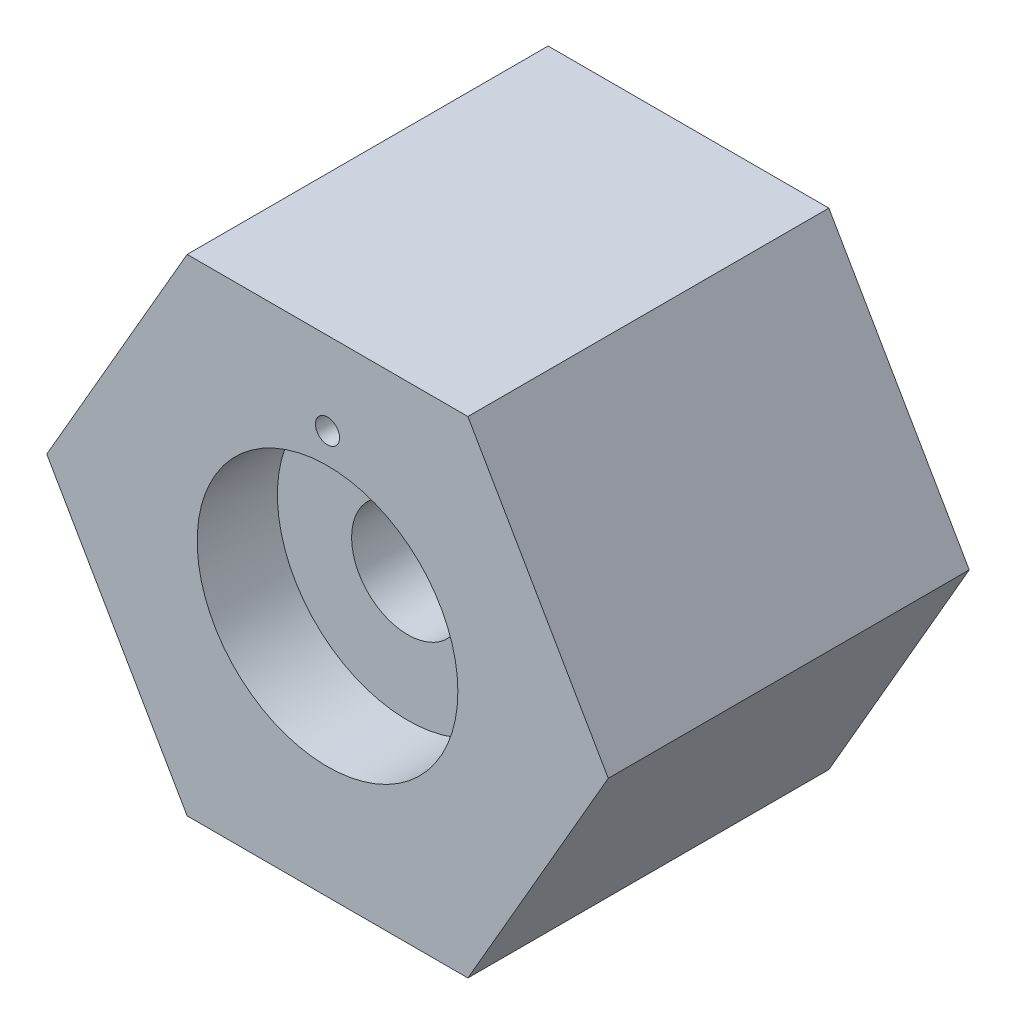
ISO-10303-21;
HEADER;
FILE_DESCRIPTION(('STEP AP214'),'2;1');
FILE_NAME('part.step','',(''),(''),'','','');
FILE_SCHEMA(('AUTOMOTIVE_DESIGN { 1 0 10303 214 1 1 1 1 }'));
ENDSEC;
DATA;
#1=APPLICATION_CONTEXT('core data for automotive mechanical design processes');
#2=APPLICATION_PROTOCOL_DEFINITION('international standard','automotive_design',2000,#1);
#3=PRODUCT_CONTEXT('',#1,'mechanical');
#4=PRODUCT('Part','Part','',(#3));
#5=PRODUCT_RELATED_PRODUCT_CATEGORY('part','',(#4));
#6=PRODUCT_DEFINITION_FORMATION('','',#4);
#7=PRODUCT_DEFINITION_CONTEXT('part definition',#1,'design');
#8=PRODUCT_DEFINITION('design','',#6,#7);
#9=PRODUCT_DEFINITION_SHAPE('','',#8);
#10=(LENGTH_UNIT() NAMED_UNIT(*) SI_UNIT(.MILLI.,.METRE.));
#11=(NAMED_UNIT(*) PLANE_ANGLE_UNIT() SI_UNIT($,.RADIAN.));
#12=(NAMED_UNIT(*) SI_UNIT($,.STERADIAN.) SOLID_ANGLE_UNIT());
#13=UNCERTAINTY_MEASURE_WITH_UNIT(LENGTH_MEASURE(1.E-05),#10,'distance_accuracy_value','');
#14=(GEOMETRIC_REPRESENTATION_CONTEXT(3) GLOBAL_UNCERTAINTY_ASSIGNED_CONTEXT((#13)) GLOBAL_UNIT_ASSIGNED_CONTEXT((#10,
#11,#12)) REPRESENTATION_CONTEXT('',''));
#15=CARTESIAN_POINT('',(0.,0.,0.));
#16=DIRECTION('',(0.,0.,1.));
#17=DIRECTION('',(1.,0.,0.));
#18=AXIS2_PLACEMENT_3D('',#15,#16,#17);
#19=CARTESIAN_POINT('',(-35.,0.,22.5));
#20=DIRECTION('',(0.866025403784439,-0.5,0.));
#21=DIRECTION('',(0.5,0.866025403784439,0.));
#22=AXIS2_PLACEMENT_3D('',#19,#20,#21);
#23=PLANE('',#22);
#24=DIRECTION('',(-0.5,-0.866025403784439,0.));
#25=VECTOR('',#24,1.);
#26=CARTESIAN_POINT('',(-35.,0.,-22.5));
#27=LINE('',#26,#25);
#28=CARTESIAN_POINT('',(-17.5,30.3108891324554,-22.5));
#29=VERTEX_POINT('',#28);
#30=CARTESIAN_POINT('',(-35.,0.,-22.5));
#31=VERTEX_POINT('',#30);
#32=EDGE_CURVE('E120',#29,#31,#27,.T.);
#33=ORIENTED_EDGE('',*,*,#32,.T.);
#34=DIRECTION('',(0.,0.,-1.));
#35=VECTOR('',#34,1.);
#36=CARTESIAN_POINT('',(-35.,0.,22.5));
#37=LINE('',#36,#35);
#38=CARTESIAN_POINT('',(-35.,0.,22.5));
#39=VERTEX_POINT('',#38);
#40=EDGE_CURVE('E11',#39,#31,#37,.T.);
#41=ORIENTED_EDGE('',*,*,#40,.F.);
#42=DIRECTION('',(-0.5,-0.866025403784439,0.));
#43=VECTOR('',#42,1.);
#44=CARTESIAN_POINT('',(-35.,0.,22.5));
#45=LINE('',#44,#43);
#46=CARTESIAN_POINT('',(-17.5,30.3108891324554,22.5));
#47=VERTEX_POINT('',#46);
#48=EDGE_CURVE('E131',#47,#39,#45,.T.);
#49=ORIENTED_EDGE('',*,*,#48,.F.);
#50=DIRECTION('',(0.,0.,-1.));
#51=VECTOR('',#50,1.);
#52=CARTESIAN_POINT('',(-17.5,30.3108891324554,22.5));
#53=LINE('',#52,#51);
#54=EDGE_CURVE('E116',#47,#29,#53,.T.);
#55=ORIENTED_EDGE('',*,*,#54,.T.);
#56=EDGE_LOOP('',(#33,#41,#49,#55));
#57=FACE_BOUND('',#56,.T.);
#58=ADVANCED_FACE('F36',(#57),#23,.F.);
#59=CARTESIAN_POINT('',(-17.5,-30.3108891324554,22.5));
#60=DIRECTION('',(0.866025403784439,0.5,0.));
#61=DIRECTION('',(-0.5,0.866025403784439,0.));
#62=AXIS2_PLACEMENT_3D('',#59,#60,#61);
#63=PLANE('',#62);
#64=DIRECTION('',(0.5,-0.866025403784439,0.));
#65=VECTOR('',#64,1.);
#66=CARTESIAN_POINT('',(-17.5,-30.3108891324554,-22.5));
#67=LINE('',#66,#65);
#68=CARTESIAN_POINT('',(-17.5,-30.3108891324554,-22.5));
#69=VERTEX_POINT('',#68);
#70=EDGE_CURVE('E123',#31,#69,#67,.T.);
#71=ORIENTED_EDGE('',*,*,#70,.T.);
#72=DIRECTION('',(0.,0.,-1.));
#73=VECTOR('',#72,1.);
#74=CARTESIAN_POINT('',(-17.5,-30.3108891324554,22.5));
#75=LINE('',#74,#73);
#76=CARTESIAN_POINT('',(-17.5,-30.3108891324554,22.5));
#77=VERTEX_POINT('',#76);
#78=EDGE_CURVE('E44',#77,#69,#75,.T.);
#79=ORIENTED_EDGE('',*,*,#78,.F.);
#80=DIRECTION('',(0.5,-0.866025403784439,0.));
#81=VECTOR('',#80,1.);
#82=CARTESIAN_POINT('',(-17.5,-30.3108891324554,22.5));
#83=LINE('',#82,#81);
#84=EDGE_CURVE('E89',#39,#77,#83,.T.);
#85=ORIENTED_EDGE('',*,*,#84,.F.);
#86=ORIENTED_EDGE('',*,*,#40,.T.);
#87=EDGE_LOOP('',(#71,#79,#85,#86));
#88=FACE_BOUND('',#87,.T.);
#89=ADVANCED_FACE('F156',(#88),#63,.F.);
#90=CARTESIAN_POINT('',(17.5,-30.3108891324554,22.5));
#91=DIRECTION('',(0.,1.,0.));
#92=DIRECTION('',(0.,0.,1.));
#93=AXIS2_PLACEMENT_3D('',#90,#91,#92);
#94=PLANE('',#93);
#95=DIRECTION('',(1.,0.,0.));
#96=VECTOR('',#95,1.);
#97=CARTESIAN_POINT('',(17.5,-30.3108891324554,-22.5));
#98=LINE('',#97,#96);
#99=CARTESIAN_POINT('',(17.5,-30.3108891324554,-22.5));
#100=VERTEX_POINT('',#99);
#101=EDGE_CURVE('E126',#69,#100,#98,.T.);
#102=ORIENTED_EDGE('',*,*,#101,.T.);
#103=DIRECTION('',(0.,0.,-1.));
#104=VECTOR('',#103,1.);
#105=CARTESIAN_POINT('',(17.5,-30.3108891324554,22.5));
#106=LINE('',#105,#104);
#107=CARTESIAN_POINT('',(17.5,-30.3108891324554,22.5));
#108=VERTEX_POINT('',#107);
#109=EDGE_CURVE('E111',#108,#100,#106,.T.);
#110=ORIENTED_EDGE('',*,*,#109,.F.);
#111=DIRECTION('',(1.,0.,0.));
#112=VECTOR('',#111,1.);
#113=CARTESIAN_POINT('',(17.5,-30.3108891324554,22.5));
#114=LINE('',#113,#112);
#115=EDGE_CURVE('E102',#77,#108,#114,.T.);
#116=ORIENTED_EDGE('',*,*,#115,.F.);
#117=ORIENTED_EDGE('',*,*,#78,.T.);
#118=EDGE_LOOP('',(#102,#110,#116,#117));
#119=FACE_BOUND('',#118,.T.);
#120=ADVANCED_FACE('F137',(#119),#94,.F.);
#121=CARTESIAN_POINT('',(35.,0.,22.5));
#122=DIRECTION('',(-0.866025403784439,0.5,0.));
#123=DIRECTION('',(-0.5,-0.866025403784439,0.));
#124=AXIS2_PLACEMENT_3D('',#121,#122,#123);
#125=PLANE('',#124);
#126=DIRECTION('',(0.5,0.866025403784439,0.));
#127=VECTOR('',#126,1.);
#128=CARTESIAN_POINT('',(35.,0.,-22.5));
#129=LINE('',#128,#127);
#130=CARTESIAN_POINT('',(35.,0.,-22.5));
#131=VERTEX_POINT('',#130);
#132=EDGE_CURVE('E110',#100,#131,#129,.T.);
#133=ORIENTED_EDGE('',*,*,#132,.T.);
#134=DIRECTION('',(0.,0.,-1.));
#135=VECTOR('',#134,1.);
#136=CARTESIAN_POINT('',(35.,0.,22.5));
#137=LINE('',#136,#135);
#138=CARTESIAN_POINT('',(35.,0.,22.5));
#139=VERTEX_POINT('',#138);
#140=EDGE_CURVE('E107',#139,#131,#137,.T.);
#141=ORIENTED_EDGE('',*,*,#140,.F.);
#142=DIRECTION('',(0.5,0.866025403784439,0.));
#143=VECTOR('',#142,1.);
#144=CARTESIAN_POINT('',(35.,0.,22.5));
#145=LINE('',#144,#143);
#146=EDGE_CURVE('E96',#108,#139,#145,.T.);
#147=ORIENTED_EDGE('',*,*,#146,.F.);
#148=ORIENTED_EDGE('',*,*,#109,.T.);
#149=EDGE_LOOP('',(#133,#141,#147,#148));
#150=FACE_BOUND('',#149,.T.);
#151=ADVANCED_FACE('F108',(#150),#125,.F.);
#152=CARTESIAN_POINT('',(17.5,30.3108891324554,22.5));
#153=DIRECTION('',(-0.866025403784439,-0.5,0.));
#154=DIRECTION('',(0.5,-0.866025403784439,0.));
#155=AXIS2_PLACEMENT_3D('',#152,#153,#154);
#156=PLANE('',#155);
#157=DIRECTION('',(-0.5,0.866025403784439,0.));
#158=VECTOR('',#157,1.);
#159=CARTESIAN_POINT('',(17.5,30.3108891324554,-22.5));
#160=LINE('',#159,#158);
#161=CARTESIAN_POINT('',(17.5,30.3108891324554,-22.5));
#162=VERTEX_POINT('',#161);
#163=EDGE_CURVE('E75',#131,#162,#160,.T.);
#164=ORIENTED_EDGE('',*,*,#163,.T.);
#165=DIRECTION('',(0.,0.,-1.));
#166=VECTOR('',#165,1.);
#167=CARTESIAN_POINT('',(17.5,30.3108891324554,22.5));
#168=LINE('',#167,#166);
#169=CARTESIAN_POINT('',(17.5,30.3108891324554,22.5));
#170=VERTEX_POINT('',#169);
#171=EDGE_CURVE('E112',#170,#162,#168,.T.);
#172=ORIENTED_EDGE('',*,*,#171,.F.);
#173=DIRECTION('',(-0.5,0.866025403784439,0.));
#174=VECTOR('',#173,1.);
#175=CARTESIAN_POINT('',(17.5,30.3108891324554,22.5));
#176=LINE('',#175,#174);
#177=EDGE_CURVE('E100',#139,#170,#176,.T.);
#178=ORIENTED_EDGE('',*,*,#177,.F.);
#179=ORIENTED_EDGE('',*,*,#140,.T.);
#180=EDGE_LOOP('',(#164,#172,#178,#179));
#181=FACE_BOUND('',#180,.T.);
#182=ADVANCED_FACE('F114',(#181),#156,.F.);
#183=CARTESIAN_POINT('',(-17.5,30.3108891324554,22.5));
#184=DIRECTION('',(0.,-1.,0.));
#185=DIRECTION('',(1.,0.,0.));
#186=AXIS2_PLACEMENT_3D('',#183,#184,#185);
#187=PLANE('',#186);
#188=DIRECTION('',(-1.,0.,0.));
#189=VECTOR('',#188,1.);
#190=CARTESIAN_POINT('',(-17.5,30.3108891324554,-22.5));
#191=LINE('',#190,#189);
#192=EDGE_CURVE('E81',#162,#29,#191,.T.);
#193=ORIENTED_EDGE('',*,*,#192,.T.);
#194=ORIENTED_EDGE('',*,*,#54,.F.);
#195=DIRECTION('',(-1.,0.,0.));
#196=VECTOR('',#195,1.);
#197=CARTESIAN_POINT('',(-17.5,30.3108891324554,22.5));
#198=LINE('',#197,#196);
#199=EDGE_CURVE('E52',#170,#47,#198,.T.);
#200=ORIENTED_EDGE('',*,*,#199,.F.);
#201=ORIENTED_EDGE('',*,*,#171,.T.);
#202=EDGE_LOOP('',(#193,#194,#200,#201));
#203=FACE_BOUND('',#202,.T.);
#204=ADVANCED_FACE('F144',(#203),#187,.F.);
#205=CARTESIAN_POINT('',(0.,0.,22.5));
#206=DIRECTION('',(0.,0.,-1.));
#207=DIRECTION('',(-1.,0.,0.));
#208=AXIS2_PLACEMENT_3D('',#205,#206,#207);
#209=PLANE('',#208);
#210=CARTESIAN_POINT('',(0.,20.,22.5));
#211=DIRECTION('',(0.,0.,1.));
#212=DIRECTION('',(1.,0.,0.));
#213=AXIS2_PLACEMENT_3D('',#210,#211,#212);
#214=CIRCLE('',#213,1.5);
#215=CARTESIAN_POINT('',(1.5,20.,22.5));
#216=VERTEX_POINT('',#215);
#217=EDGE_CURVE('E289',#216,#216,#214,.T.);
#218=ORIENTED_EDGE('',*,*,#217,.F.);
#219=EDGE_LOOP('',(#218));
#220=FACE_BOUND('',#219,.T.);
#221=CARTESIAN_POINT('',(0.,0.,22.5));
#222=DIRECTION('',(0.,0.,1.));
#223=DIRECTION('',(1.,0.,0.));
#224=AXIS2_PLACEMENT_3D('',#221,#222,#223);
#225=CIRCLE('',#224,16.25);
#226=CARTESIAN_POINT('',(16.25,0.,22.5));
#227=VERTEX_POINT('',#226);
#228=EDGE_CURVE('E310',#227,#227,#225,.T.);
#229=ORIENTED_EDGE('',*,*,#228,.F.);
#230=EDGE_LOOP('',(#229));
#231=FACE_BOUND('',#230,.T.);
#232=ORIENTED_EDGE('',*,*,#48,.T.);
#233=ORIENTED_EDGE('',*,*,#84,.T.);
#234=ORIENTED_EDGE('',*,*,#115,.T.);
#235=ORIENTED_EDGE('',*,*,#146,.T.);
#236=ORIENTED_EDGE('',*,*,#177,.T.);
#237=ORIENTED_EDGE('',*,*,#199,.T.);
#238=EDGE_LOOP('',(#232,#233,#234,#235,#236,#237));
#239=FACE_BOUND('',#238,.T.);
#240=ADVANCED_FACE('F98',(#220,#231,#239),#209,.F.);
#241=CARTESIAN_POINT('',(0.,0.,-22.5));
#242=DIRECTION('',(0.,0.,-1.));
#243=DIRECTION('',(-1.,0.,0.));
#244=AXIS2_PLACEMENT_3D('',#241,#242,#243);
#245=PLANE('',#244);
#246=CARTESIAN_POINT('',(0.,20.,-22.5));
#247=DIRECTION('',(0.,0.,1.));
#248=DIRECTION('',(1.,0.,0.));
#249=AXIS2_PLACEMENT_3D('',#246,#247,#248);
#250=CIRCLE('',#249,1.5);
#251=CARTESIAN_POINT('',(1.5,20.,-22.5));
#252=VERTEX_POINT('',#251);
#253=EDGE_CURVE('E290',#252,#252,#250,.T.);
#254=ORIENTED_EDGE('',*,*,#253,.T.);
#255=EDGE_LOOP('',(#254));
#256=FACE_BOUND('',#255,.T.);
#257=CARTESIAN_POINT('',(0.,0.,-22.5));
#258=DIRECTION('',(0.,0.,1.));
#259=DIRECTION('',(1.,0.,0.));
#260=AXIS2_PLACEMENT_3D('',#257,#258,#259);
#261=CIRCLE('',#260,16.25);
#262=CARTESIAN_POINT('',(16.25,0.,-22.5));
#263=VERTEX_POINT('',#262);
#264=EDGE_CURVE('E306',#263,#263,#261,.T.);
#265=ORIENTED_EDGE('',*,*,#264,.T.);
#266=EDGE_LOOP('',(#265));
#267=FACE_BOUND('',#266,.T.);
#268=ORIENTED_EDGE('',*,*,#32,.F.);
#269=ORIENTED_EDGE('',*,*,#192,.F.);
#270=ORIENTED_EDGE('',*,*,#163,.F.);
#271=ORIENTED_EDGE('',*,*,#132,.F.);
#272=ORIENTED_EDGE('',*,*,#101,.F.);
#273=ORIENTED_EDGE('',*,*,#70,.F.);
#274=EDGE_LOOP('',(#268,#269,#270,#271,#272,#273));
#275=FACE_BOUND('',#274,.T.);
#276=ADVANCED_FACE('F140',(#256,#267,#275),#245,.T.);
#277=CARTESIAN_POINT('',(0.,0.,12.5));
#278=DIRECTION('',(0.,0.,1.));
#279=DIRECTION('',(1.,0.,0.));
#280=AXIS2_PLACEMENT_3D('',#277,#278,#279);
#281=CYLINDRICAL_SURFACE('',#280,16.25);
#282=CARTESIAN_POINT('',(0.,0.,12.5));
#283=DIRECTION('',(0.,0.,1.));
#284=DIRECTION('',(1.,0.,0.));
#285=AXIS2_PLACEMENT_3D('',#282,#283,#284);
#286=CIRCLE('',#285,16.25);
#287=CARTESIAN_POINT('',(16.25,0.,12.5));
#288=VERTEX_POINT('',#287);
#289=EDGE_CURVE('E124',#288,#288,#286,.T.);
#290=ORIENTED_EDGE('',*,*,#289,.F.);
#291=EDGE_LOOP('',(#290));
#292=FACE_BOUND('',#291,.T.);
#293=ORIENTED_EDGE('',*,*,#228,.T.);
#294=EDGE_LOOP('',(#293));
#295=FACE_BOUND('',#294,.T.);
#296=ADVANCED_FACE('F184',(#292,#295),#281,.F.);
#297=CARTESIAN_POINT('',(0.,0.,12.5));
#298=DIRECTION('',(0.,0.,1.));
#299=DIRECTION('',(1.,0.,0.));
#300=AXIS2_PLACEMENT_3D('',#297,#298,#299);
#301=PLANE('',#300);
#302=CARTESIAN_POINT('',(0.,0.,12.5));
#303=DIRECTION('',(0.,0.,1.));
#304=DIRECTION('',(1.,0.,0.));
#305=AXIS2_PLACEMENT_3D('',#302,#303,#304);
#306=CIRCLE('',#305,7.);
#307=CARTESIAN_POINT('',(7.,0.,12.5));
#308=VERTEX_POINT('',#307);
#309=EDGE_CURVE('E303',#308,#308,#306,.F.);
#310=ORIENTED_EDGE('',*,*,#309,.T.);
#311=EDGE_LOOP('',(#310));
#312=FACE_BOUND('',#311,.T.);
#313=ORIENTED_EDGE('',*,*,#289,.T.);
#314=EDGE_LOOP('',(#313));
#315=FACE_BOUND('',#314,.T.);
#316=ADVANCED_FACE('F189',(#312,#315),#301,.T.);
#317=CARTESIAN_POINT('',(0.,0.,-12.5));
#318=DIRECTION('',(0.,0.,-1.));
#319=DIRECTION('',(-1.,0.,0.));
#320=AXIS2_PLACEMENT_3D('',#317,#318,#319);
#321=CYLINDRICAL_SURFACE('',#320,16.25);
#322=CARTESIAN_POINT('',(0.,0.,-12.5));
#323=DIRECTION('',(0.,0.,1.));
#324=DIRECTION('',(1.,0.,0.));
#325=AXIS2_PLACEMENT_3D('',#322,#323,#324);
#326=CIRCLE('',#325,16.25);
#327=CARTESIAN_POINT('',(16.25,0.,-12.5));
#328=VERTEX_POINT('',#327);
#329=EDGE_CURVE('E307',#328,#328,#326,.T.);
#330=ORIENTED_EDGE('',*,*,#329,.T.);
#331=EDGE_LOOP('',(#330));
#332=FACE_BOUND('',#331,.T.);
#333=ORIENTED_EDGE('',*,*,#264,.F.);
#334=EDGE_LOOP('',(#333));
#335=FACE_BOUND('',#334,.T.);
#336=ADVANCED_FACE('F199',(#332,#335),#321,.F.);
#337=CARTESIAN_POINT('',(0.,0.,-12.5));
#338=DIRECTION('',(0.,0.,-1.));
#339=DIRECTION('',(1.,0.,0.));
#340=AXIS2_PLACEMENT_3D('',#337,#338,#339);
#341=PLANE('',#340);
#342=CARTESIAN_POINT('',(0.,0.,-12.5));
#343=DIRECTION('',(0.,0.,-1.));
#344=DIRECTION('',(-1.,0.,0.));
#345=AXIS2_PLACEMENT_3D('',#342,#343,#344);
#346=CIRCLE('',#345,7.);
#347=CARTESIAN_POINT('',(-7.,0.,-12.5));
#348=VERTEX_POINT('',#347);
#349=EDGE_CURVE('E299',#348,#348,#346,.T.);
#350=ORIENTED_EDGE('',*,*,#349,.F.);
#351=EDGE_LOOP('',(#350));
#352=FACE_BOUND('',#351,.T.);
#353=ORIENTED_EDGE('',*,*,#329,.F.);
#354=EDGE_LOOP('',(#353));
#355=FACE_BOUND('',#354,.T.);
#356=ADVANCED_FACE('F204',(#352,#355),#341,.T.);
#357=CARTESIAN_POINT('',(0.,0.,32.2989898732233));
#358=DIRECTION('',(0.,0.,-1.));
#359=DIRECTION('',(-1.,0.,0.));
#360=AXIS2_PLACEMENT_3D('',#357,#358,#359);
#361=CYLINDRICAL_SURFACE('',#360,7.);
#362=ORIENTED_EDGE('',*,*,#349,.T.);
#363=EDGE_LOOP('',(#362));
#364=FACE_BOUND('',#363,.T.);
#365=ORIENTED_EDGE('',*,*,#309,.F.);
#366=EDGE_LOOP('',(#365));
#367=FACE_BOUND('',#366,.T.);
#368=ADVANCED_FACE('F221',(#364,#367),#361,.F.);
#369=CARTESIAN_POINT('',(0.,20.,12.5));
#370=DIRECTION('',(0.,0.,1.));
#371=DIRECTION('',(1.,0.,0.));
#372=AXIS2_PLACEMENT_3D('',#369,#370,#371);
#373=CYLINDRICAL_SURFACE('',#372,1.5);
#374=CARTESIAN_POINT('',(0.,20.,12.5));
#375=DIRECTION('',(0.,0.,1.));
#376=DIRECTION('',(1.,0.,0.));
#377=AXIS2_PLACEMENT_3D('',#374,#375,#376);
#378=CIRCLE('',#377,1.5);
#379=CARTESIAN_POINT('',(1.5,20.,12.5));
#380=VERTEX_POINT('',#379);
#381=EDGE_CURVE('E293',#380,#380,#378,.T.);
#382=ORIENTED_EDGE('',*,*,#381,.F.);
#383=EDGE_LOOP('',(#382));
#384=FACE_BOUND('',#383,.T.);
#385=ORIENTED_EDGE('',*,*,#217,.T.);
#386=EDGE_LOOP('',(#385));
#387=FACE_BOUND('',#386,.T.);
#388=ADVANCED_FACE('F231',(#384,#387),#373,.F.);
#389=CARTESIAN_POINT('',(0.,20.,12.5));
#390=DIRECTION('',(0.,0.,1.));
#391=DIRECTION('',(1.,0.,0.));
#392=AXIS2_PLACEMENT_3D('',#389,#390,#391);
#393=PLANE('',#392);
#394=ORIENTED_EDGE('',*,*,#381,.T.);
#395=EDGE_LOOP('',(#394));
#396=FACE_BOUND('',#395,.T.);
#397=ADVANCED_FACE('F246',(#396),#393,.T.);
#398=CARTESIAN_POINT('',(0.,20.,-12.5));
#399=DIRECTION('',(0.,0.,-1.));
#400=DIRECTION('',(-1.,0.,0.));
#401=AXIS2_PLACEMENT_3D('',#398,#399,#400);
#402=CYLINDRICAL_SURFACE('',#401,1.5);
#403=CARTESIAN_POINT('',(0.,20.,-12.5));
#404=DIRECTION('',(0.,0.,1.));
#405=DIRECTION('',(1.,0.,0.));
#406=AXIS2_PLACEMENT_3D('',#403,#404,#405);
#407=CIRCLE('',#406,1.5);
#408=CARTESIAN_POINT('',(1.5,20.,-12.5));
#409=VERTEX_POINT('',#408);
#410=EDGE_CURVE('E288',#409,#409,#407,.T.);
#411=ORIENTED_EDGE('',*,*,#410,.T.);
#412=EDGE_LOOP('',(#411));
#413=FACE_BOUND('',#412,.T.);
#414=ORIENTED_EDGE('',*,*,#253,.F.);
#415=EDGE_LOOP('',(#414));
#416=FACE_BOUND('',#415,.T.);
#417=ADVANCED_FACE('F256',(#413,#416),#402,.F.);
#418=CARTESIAN_POINT('',(0.,20.,-12.5));
#419=DIRECTION('',(0.,0.,-1.));
#420=DIRECTION('',(1.,0.,0.));
#421=AXIS2_PLACEMENT_3D('',#418,#419,#420);
#422=PLANE('',#421);
#423=ORIENTED_EDGE('',*,*,#410,.F.);
#424=EDGE_LOOP('',(#423));
#425=FACE_BOUND('',#424,.T.);
#426=ADVANCED_FACE('F272',(#425),#422,.T.);
#427=CLOSED_SHELL('',(#58,#89,#120,#151,#182,#204,#240,#276,#296,#316,#336,#356,#368,#388,#397,
#417,#426));
#428=MANIFOLD_SOLID_BREP('B2',#427);
#429=ADVANCED_BREP_SHAPE_REPRESENTATION('',(#18,#428),#14);
#430=SHAPE_DEFINITION_REPRESENTATION(#9,#429);
ENDSEC;
END-ISO-10303-21;
